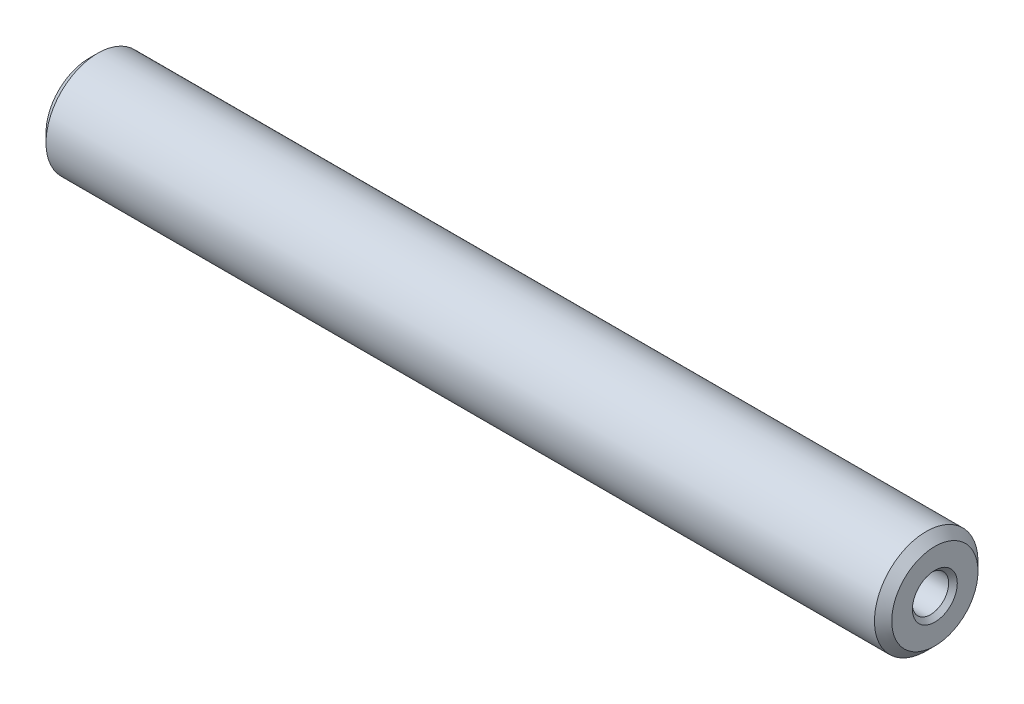
ISO-10303-21;
HEADER;
FILE_DESCRIPTION(('STEP AP214'),'2;1');
FILE_NAME('part.step','',(''),(''),'','','');
FILE_SCHEMA(('AUTOMOTIVE_DESIGN { 1 0 10303 214 1 1 1 1 }'));
ENDSEC;
DATA;
#1=APPLICATION_CONTEXT('core data for automotive mechanical design processes');
#2=APPLICATION_PROTOCOL_DEFINITION('international standard','automotive_design',2000,#1);
#3=PRODUCT_CONTEXT('',#1,'mechanical');
#4=PRODUCT('Part','Part','',(#3));
#5=PRODUCT_RELATED_PRODUCT_CATEGORY('part','',(#4));
#6=PRODUCT_DEFINITION_FORMATION('','',#4);
#7=PRODUCT_DEFINITION_CONTEXT('part definition',#1,'design');
#8=PRODUCT_DEFINITION('design','',#6,#7);
#9=PRODUCT_DEFINITION_SHAPE('','',#8);
#10=(LENGTH_UNIT() NAMED_UNIT(*) SI_UNIT(.MILLI.,.METRE.));
#11=(NAMED_UNIT(*) PLANE_ANGLE_UNIT() SI_UNIT($,.RADIAN.));
#12=(NAMED_UNIT(*) SI_UNIT($,.STERADIAN.) SOLID_ANGLE_UNIT());
#13=UNCERTAINTY_MEASURE_WITH_UNIT(LENGTH_MEASURE(1.E-05),#10,'distance_accuracy_value','');
#14=(GEOMETRIC_REPRESENTATION_CONTEXT(3) GLOBAL_UNCERTAINTY_ASSIGNED_CONTEXT((#13)) GLOBAL_UNIT_ASSIGNED_CONTEXT((#10,
#11,#12)) REPRESENTATION_CONTEXT('',''));
#15=CARTESIAN_POINT('',(0.,0.,0.));
#16=DIRECTION('',(0.,0.,1.));
#17=DIRECTION('',(1.,0.,0.));
#18=AXIS2_PLACEMENT_3D('',#15,#16,#17);
#19=CARTESIAN_POINT('',(98.,0.,0.));
#20=DIRECTION('',(-1.,0.,0.));
#21=DIRECTION('',(0.,0.,1.));
#22=AXIS2_PLACEMENT_3D('',#19,#20,#21);
#23=CYLINDRICAL_SURFACE('',#22,6.);
#24=CARTESIAN_POINT('',(97.,0.,0.));
#25=DIRECTION('',(1.,0.,0.));
#26=DIRECTION('',(0.,0.,-1.));
#27=AXIS2_PLACEMENT_3D('',#24,#25,#26);
#28=CIRCLE('',#27,6.);
#29=CARTESIAN_POINT('',(97.,0.,-6.));
#30=VERTEX_POINT('',#29);
#31=EDGE_CURVE('E72',#30,#30,#28,.F.);
#32=ORIENTED_EDGE('',*,*,#31,.T.);
#33=EDGE_LOOP('',(#32));
#34=FACE_BOUND('',#33,.T.);
#35=CARTESIAN_POINT('',(0.999999999999987,0.,0.));
#36=DIRECTION('',(1.,0.,0.));
#37=DIRECTION('',(0.,0.,-1.));
#38=AXIS2_PLACEMENT_3D('',#35,#36,#37);
#39=CIRCLE('',#38,6.);
#40=CARTESIAN_POINT('',(0.999999999999987,0.,-6.));
#41=VERTEX_POINT('',#40);
#42=EDGE_CURVE('E69',#41,#41,#39,.T.);
#43=ORIENTED_EDGE('',*,*,#42,.T.);
#44=EDGE_LOOP('',(#43));
#45=FACE_BOUND('',#44,.T.);
#46=ADVANCED_FACE('F37',(#34,#45),#23,.T.);
#47=CARTESIAN_POINT('',(98.,0.,0.));
#48=DIRECTION('',(1.,0.,0.));
#49=DIRECTION('',(0.,0.,-1.));
#50=AXIS2_PLACEMENT_3D('',#47,#48,#49);
#51=PLANE('',#50);
#52=CARTESIAN_POINT('',(98.,0.,0.));
#53=DIRECTION('',(1.,0.,0.));
#54=DIRECTION('',(0.,0.,-1.));
#55=AXIS2_PLACEMENT_3D('',#52,#53,#54);
#56=CIRCLE('',#55,2.59999999999998);
#57=CARTESIAN_POINT('',(98.,0.,-2.59999999999998));
#58=VERTEX_POINT('',#57);
#59=EDGE_CURVE('E81',#58,#58,#56,.F.);
#60=ORIENTED_EDGE('',*,*,#59,.T.);
#61=EDGE_LOOP('',(#60));
#62=FACE_BOUND('',#61,.T.);
#63=CARTESIAN_POINT('',(98.,0.,0.));
#64=DIRECTION('',(1.,0.,0.));
#65=DIRECTION('',(0.,0.,-1.));
#66=AXIS2_PLACEMENT_3D('',#63,#64,#65);
#67=CIRCLE('',#66,4.99999999999999);
#68=CARTESIAN_POINT('',(98.,0.,-4.99999999999999));
#69=VERTEX_POINT('',#68);
#70=EDGE_CURVE('E64',#69,#69,#67,.T.);
#71=ORIENTED_EDGE('',*,*,#70,.T.);
#72=EDGE_LOOP('',(#71));
#73=FACE_BOUND('',#72,.T.);
#74=ADVANCED_FACE('F95',(#62,#73),#51,.T.);
#75=CARTESIAN_POINT('',(0.,0.,0.));
#76=DIRECTION('',(1.,0.,0.));
#77=DIRECTION('',(0.,0.,-1.));
#78=AXIS2_PLACEMENT_3D('',#75,#76,#77);
#79=PLANE('',#78);
#80=CARTESIAN_POINT('',(0.,0.,0.));
#81=DIRECTION('',(1.,0.,0.));
#82=DIRECTION('',(0.,0.,-1.));
#83=AXIS2_PLACEMENT_3D('',#80,#81,#82);
#84=CIRCLE('',#83,2.59999999999998);
#85=CARTESIAN_POINT('',(0.,0.,-2.59999999999998));
#86=VERTEX_POINT('',#85);
#87=EDGE_CURVE('E11',#86,#86,#84,.T.);
#88=ORIENTED_EDGE('',*,*,#87,.T.);
#89=EDGE_LOOP('',(#88));
#90=FACE_BOUND('',#89,.T.);
#91=CARTESIAN_POINT('',(0.,0.,0.));
#92=DIRECTION('',(1.,0.,0.));
#93=DIRECTION('',(0.,0.,-1.));
#94=AXIS2_PLACEMENT_3D('',#91,#92,#93);
#95=CIRCLE('',#94,5.00000000000002);
#96=CARTESIAN_POINT('',(0.,0.,-5.00000000000002));
#97=VERTEX_POINT('',#96);
#98=EDGE_CURVE('E75',#97,#97,#95,.F.);
#99=ORIENTED_EDGE('',*,*,#98,.T.);
#100=EDGE_LOOP('',(#99));
#101=FACE_BOUND('',#100,.T.);
#102=ADVANCED_FACE('F101',(#90,#101),#79,.F.);
#103=CARTESIAN_POINT('',(98.,0.,0.));
#104=DIRECTION('',(-1.,0.,0.));
#105=DIRECTION('',(0.,0.,1.));
#106=AXIS2_PLACEMENT_3D('',#103,#104,#105);
#107=CONICAL_SURFACE('',#106,4.99999999999999,0.785398163397446);
#108=ORIENTED_EDGE('',*,*,#31,.F.);
#109=EDGE_LOOP('',(#108));
#110=FACE_BOUND('',#109,.T.);
#111=ORIENTED_EDGE('',*,*,#70,.F.);
#112=EDGE_LOOP('',(#111));
#113=FACE_BOUND('',#112,.T.);
#114=ADVANCED_FACE('F107',(#110,#113),#107,.T.);
#115=CARTESIAN_POINT('',(0.999999999999987,0.,0.));
#116=DIRECTION('',(1.,0.,0.));
#117=DIRECTION('',(0.,0.,-1.));
#118=AXIS2_PLACEMENT_3D('',#115,#116,#117);
#119=CONICAL_SURFACE('',#118,6.,0.785398163397446);
#120=ORIENTED_EDGE('',*,*,#98,.F.);
#121=EDGE_LOOP('',(#120));
#122=FACE_BOUND('',#121,.T.);
#123=ORIENTED_EDGE('',*,*,#42,.F.);
#124=EDGE_LOOP('',(#123));
#125=FACE_BOUND('',#124,.T.);
#126=ADVANCED_FACE('F110',(#122,#125),#119,.T.);
#127=CARTESIAN_POINT('',(84.,0.,0.));
#128=DIRECTION('',(1.,0.,0.));
#129=DIRECTION('',(0.,0.,-1.));
#130=AXIS2_PLACEMENT_3D('',#127,#128,#129);
#131=CONICAL_SURFACE('',#130,2.09999999999999,1.02974425867665);
#132=CARTESIAN_POINT('',(82.7381927000421,0.,0.));
#133=VERTEX_POINT('',#132);
#134=VERTEX_LOOP('',#133);
#135=FACE_BOUND('',#134,.T.);
#136=CARTESIAN_POINT('',(84.,0.,0.));
#137=DIRECTION('',(1.,0.,0.));
#138=DIRECTION('',(0.,0.,-1.));
#139=AXIS2_PLACEMENT_3D('',#136,#137,#138);
#140=CIRCLE('',#139,2.09999999999999);
#141=CARTESIAN_POINT('',(84.,0.,-2.09999999999999));
#142=VERTEX_POINT('',#141);
#143=EDGE_CURVE('E61',#142,#142,#140,.T.);
#144=ORIENTED_EDGE('',*,*,#143,.T.);
#145=EDGE_LOOP('',(#144));
#146=FACE_BOUND('',#145,.T.);
#147=ADVANCED_FACE('F113',(#135,#146),#131,.F.);
#148=CARTESIAN_POINT('',(98.,0.,0.));
#149=DIRECTION('',(1.,0.,0.));
#150=DIRECTION('',(0.,0.,-1.));
#151=AXIS2_PLACEMENT_3D('',#148,#149,#150);
#152=CYLINDRICAL_SURFACE('',#151,2.09999999999999);
#153=CARTESIAN_POINT('',(97.5,0.,0.));
#154=DIRECTION('',(1.,0.,0.));
#155=DIRECTION('',(0.,0.,-1.));
#156=AXIS2_PLACEMENT_3D('',#153,#154,#155);
#157=CIRCLE('',#156,2.09999999999999);
#158=CARTESIAN_POINT('',(97.5,0.,-2.09999999999999));
#159=VERTEX_POINT('',#158);
#160=EDGE_CURVE('E78',#159,#159,#157,.T.);
#161=ORIENTED_EDGE('',*,*,#160,.T.);
#162=EDGE_LOOP('',(#161));
#163=FACE_BOUND('',#162,.T.);
#164=ORIENTED_EDGE('',*,*,#143,.F.);
#165=EDGE_LOOP('',(#164));
#166=FACE_BOUND('',#165,.T.);
#167=ADVANCED_FACE('F116',(#163,#166),#152,.F.);
#168=CARTESIAN_POINT('',(97.5,0.,0.));
#169=DIRECTION('',(1.,0.,0.));
#170=DIRECTION('',(0.,0.,-1.));
#171=AXIS2_PLACEMENT_3D('',#168,#169,#170);
#172=CONICAL_SURFACE('',#171,2.09999999999999,0.785398163397437);
#173=ORIENTED_EDGE('',*,*,#59,.F.);
#174=EDGE_LOOP('',(#173));
#175=FACE_BOUND('',#174,.T.);
#176=ORIENTED_EDGE('',*,*,#160,.F.);
#177=EDGE_LOOP('',(#176));
#178=FACE_BOUND('',#177,.T.);
#179=ADVANCED_FACE('F55',(#175,#178),#172,.F.);
#180=CARTESIAN_POINT('',(14.,0.,0.));
#181=DIRECTION('',(-1.,0.,0.));
#182=DIRECTION('',(0.,0.,1.));
#183=AXIS2_PLACEMENT_3D('',#180,#181,#182);
#184=CONICAL_SURFACE('',#183,2.09999999999999,1.02974425867665);
#185=CARTESIAN_POINT('',(15.2618072999579,0.,0.));
#186=VERTEX_POINT('',#185);
#187=VERTEX_LOOP('',#186);
#188=FACE_BOUND('',#187,.T.);
#189=CARTESIAN_POINT('',(14.,0.,0.));
#190=DIRECTION('',(-1.,0.,0.));
#191=DIRECTION('',(0.,0.,1.));
#192=AXIS2_PLACEMENT_3D('',#189,#190,#191);
#193=CIRCLE('',#192,2.09999999999999);
#194=CARTESIAN_POINT('',(14.,0.,2.09999999999999));
#195=VERTEX_POINT('',#194);
#196=EDGE_CURVE('E59',#195,#195,#193,.T.);
#197=ORIENTED_EDGE('',*,*,#196,.T.);
#198=EDGE_LOOP('',(#197));
#199=FACE_BOUND('',#198,.T.);
#200=ADVANCED_FACE('F51',(#188,#199),#184,.F.);
#201=CARTESIAN_POINT('',(0.,0.,0.));
#202=DIRECTION('',(-1.,0.,0.));
#203=DIRECTION('',(0.,0.,1.));
#204=AXIS2_PLACEMENT_3D('',#201,#202,#203);
#205=CYLINDRICAL_SURFACE('',#204,2.09999999999999);
#206=CARTESIAN_POINT('',(0.499999999999982,0.,0.));
#207=DIRECTION('',(1.,0.,0.));
#208=DIRECTION('',(0.,0.,-1.));
#209=AXIS2_PLACEMENT_3D('',#206,#207,#208);
#210=CIRCLE('',#209,2.09999999999999);
#211=CARTESIAN_POINT('',(0.499999999999982,0.,-2.09999999999999));
#212=VERTEX_POINT('',#211);
#213=EDGE_CURVE('E45',#212,#212,#210,.F.);
#214=ORIENTED_EDGE('',*,*,#213,.T.);
#215=EDGE_LOOP('',(#214));
#216=FACE_BOUND('',#215,.T.);
#217=ORIENTED_EDGE('',*,*,#196,.F.);
#218=EDGE_LOOP('',(#217));
#219=FACE_BOUND('',#218,.T.);
#220=ADVANCED_FACE('F54',(#216,#219),#205,.F.);
#221=CARTESIAN_POINT('',(0.499999999999982,0.,0.));
#222=DIRECTION('',(-1.,0.,0.));
#223=DIRECTION('',(0.,0.,1.));
#224=AXIS2_PLACEMENT_3D('',#221,#222,#223);
#225=CONICAL_SURFACE('',#224,2.09999999999999,0.785398163397455);
#226=ORIENTED_EDGE('',*,*,#87,.F.);
#227=EDGE_LOOP('',(#226));
#228=FACE_BOUND('',#227,.T.);
#229=ORIENTED_EDGE('',*,*,#213,.F.);
#230=EDGE_LOOP('',(#229));
#231=FACE_BOUND('',#230,.T.);
#232=ADVANCED_FACE('F39',(#228,#231),#225,.F.);
#233=CLOSED_SHELL('',(#46,#74,#102,#114,#126,#147,#167,#179,#200,#220,#232));
#234=MANIFOLD_SOLID_BREP('B2',#233);
#235=ADVANCED_BREP_SHAPE_REPRESENTATION('',(#18,#234),#14);
#236=SHAPE_DEFINITION_REPRESENTATION(#9,#235);
ENDSEC;
END-ISO-10303-21;
